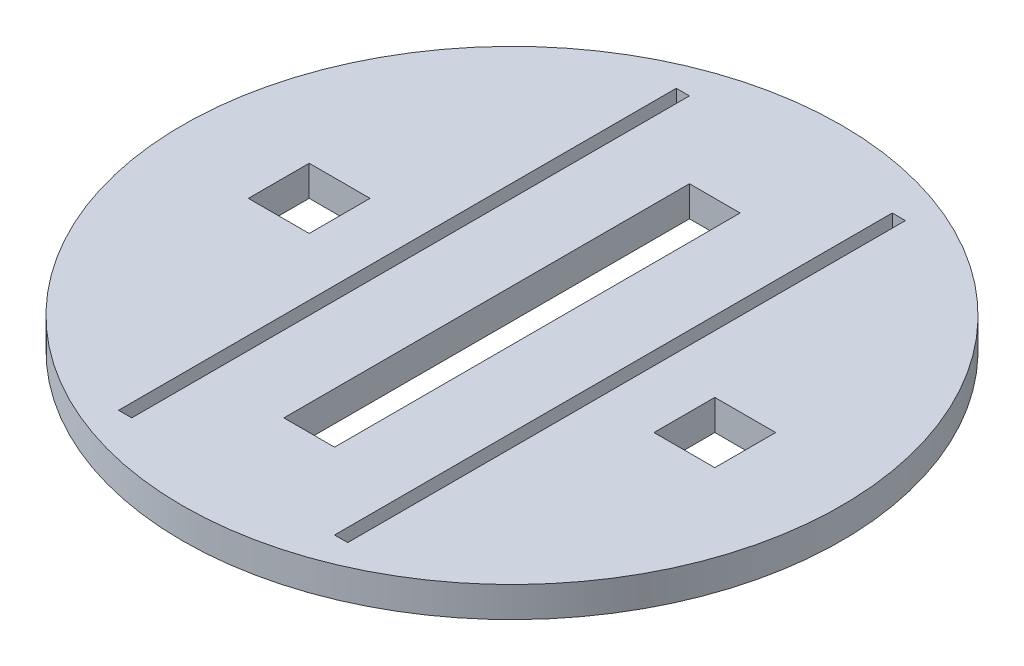
ISO-10303-21;
HEADER;
FILE_DESCRIPTION(('STEP AP214'),'2;1');
FILE_NAME('part.step','',(''),(''),'','','');
FILE_SCHEMA(('AUTOMOTIVE_DESIGN { 1 0 10303 214 1 1 1 1 }'));
ENDSEC;
DATA;
#1=APPLICATION_CONTEXT('core data for automotive mechanical design processes');
#2=APPLICATION_PROTOCOL_DEFINITION('international standard','automotive_design',2000,#1);
#3=PRODUCT_CONTEXT('',#1,'mechanical');
#4=PRODUCT('Part','Part','',(#3));
#5=PRODUCT_RELATED_PRODUCT_CATEGORY('part','',(#4));
#6=PRODUCT_DEFINITION_FORMATION('','',#4);
#7=PRODUCT_DEFINITION_CONTEXT('part definition',#1,'design');
#8=PRODUCT_DEFINITION('design','',#6,#7);
#9=PRODUCT_DEFINITION_SHAPE('','',#8);
#10=(LENGTH_UNIT() NAMED_UNIT(*) SI_UNIT(.MILLI.,.METRE.));
#11=(NAMED_UNIT(*) PLANE_ANGLE_UNIT() SI_UNIT($,.RADIAN.));
#12=(NAMED_UNIT(*) SI_UNIT($,.STERADIAN.) SOLID_ANGLE_UNIT());
#13=UNCERTAINTY_MEASURE_WITH_UNIT(LENGTH_MEASURE(1.E-05),#10,'distance_accuracy_value','');
#14=(GEOMETRIC_REPRESENTATION_CONTEXT(3) GLOBAL_UNCERTAINTY_ASSIGNED_CONTEXT((#13)) GLOBAL_UNIT_ASSIGNED_CONTEXT((#10,
#11,#12)) REPRESENTATION_CONTEXT('',''));
#15=CARTESIAN_POINT('',(0.,0.,0.));
#16=DIRECTION('',(0.,0.,1.));
#17=DIRECTION('',(1.,0.,0.));
#18=AXIS2_PLACEMENT_3D('',#15,#16,#17);
#19=CARTESIAN_POINT('',(0.,3.,0.));
#20=DIRECTION('',(0.,1.,0.));
#21=DIRECTION('',(0.,0.,1.));
#22=AXIS2_PLACEMENT_3D('',#19,#20,#21);
#23=PLANE('',#22);
#24=DIRECTION('',(0.,0.,1.));
#25=VECTOR('',#24,1.);
#26=CARTESIAN_POINT('',(-2.5,3.,0.));
#27=LINE('',#26,#25);
#28=CARTESIAN_POINT('',(-2.5,3.,-20.));
#29=VERTEX_POINT('',#28);
#30=CARTESIAN_POINT('',(-2.5,3.,20.));
#31=VERTEX_POINT('',#30);
#32=EDGE_CURVE('E218',#29,#31,#27,.T.);
#33=ORIENTED_EDGE('',*,*,#32,.F.);
#34=DIRECTION('',(-1.,0.,0.));
#35=VECTOR('',#34,1.);
#36=CARTESIAN_POINT('',(0.,3.,-20.));
#37=LINE('',#36,#35);
#38=CARTESIAN_POINT('',(2.5,3.,-20.));
#39=VERTEX_POINT('',#38);
#40=EDGE_CURVE('E211',#39,#29,#37,.T.);
#41=ORIENTED_EDGE('',*,*,#40,.F.);
#42=DIRECTION('',(0.,0.,-1.));
#43=VECTOR('',#42,1.);
#44=CARTESIAN_POINT('',(2.5,3.,0.));
#45=LINE('',#44,#43);
#46=CARTESIAN_POINT('',(2.5,3.,20.));
#47=VERTEX_POINT('',#46);
#48=EDGE_CURVE('E191',#47,#39,#45,.T.);
#49=ORIENTED_EDGE('',*,*,#48,.F.);
#50=DIRECTION('',(1.,0.,0.));
#51=VECTOR('',#50,1.);
#52=CARTESIAN_POINT('',(0.,3.,20.));
#53=LINE('',#52,#51);
#54=EDGE_CURVE('E216',#31,#47,#53,.T.);
#55=ORIENTED_EDGE('',*,*,#54,.F.);
#56=EDGE_LOOP('',(#33,#41,#49,#55));
#57=FACE_BOUND('',#56,.T.);
#58=DIRECTION('',(-1.,0.,0.));
#59=VECTOR('',#58,1.);
#60=CARTESIAN_POINT('',(0.,3.,-27.5));
#61=LINE('',#60,#59);
#62=CARTESIAN_POINT('',(-10.,3.,-27.5));
#63=VERTEX_POINT('',#62);
#64=CARTESIAN_POINT('',(-11.3,3.,-27.5));
#65=VERTEX_POINT('',#64);
#66=EDGE_CURVE('E323',#63,#65,#61,.T.);
#67=ORIENTED_EDGE('',*,*,#66,.F.);
#68=DIRECTION('',(0.,0.,-1.));
#69=VECTOR('',#68,1.);
#70=CARTESIAN_POINT('',(-10.,3.,0.));
#71=LINE('',#70,#69);
#72=CARTESIAN_POINT('',(-10.,3.,27.5));
#73=VERTEX_POINT('',#72);
#74=EDGE_CURVE('E325',#73,#63,#71,.T.);
#75=ORIENTED_EDGE('',*,*,#74,.F.);
#76=DIRECTION('',(-1.,0.,0.));
#77=VECTOR('',#76,1.);
#78=CARTESIAN_POINT('',(0.,3.,27.5));
#79=LINE('',#78,#77);
#80=CARTESIAN_POINT('',(-11.3,3.,27.5));
#81=VERTEX_POINT('',#80);
#82=EDGE_CURVE('E320',#73,#81,#79,.T.);
#83=ORIENTED_EDGE('',*,*,#82,.T.);
#84=DIRECTION('',(0.,0.,1.));
#85=VECTOR('',#84,1.);
#86=CARTESIAN_POINT('',(-11.3,3.,0.));
#87=LINE('',#86,#85);
#88=EDGE_CURVE('E327',#65,#81,#87,.T.);
#89=ORIENTED_EDGE('',*,*,#88,.F.);
#90=EDGE_LOOP('',(#67,#75,#83,#89));
#91=FACE_BOUND('',#90,.T.);
#92=CARTESIAN_POINT('',(0.,3.,0.));
#93=DIRECTION('',(0.,1.,0.));
#94=DIRECTION('',(0.,0.,1.));
#95=AXIS2_PLACEMENT_3D('',#92,#93,#94);
#96=CIRCLE('',#95,32.5);
#97=CARTESIAN_POINT('',(0.,3.,32.5));
#98=VERTEX_POINT('',#97);
#99=EDGE_CURVE('E331',#98,#98,#96,.T.);
#100=ORIENTED_EDGE('',*,*,#99,.T.);
#101=EDGE_LOOP('',(#100));
#102=FACE_BOUND('',#101,.T.);
#103=DIRECTION('',(0.,0.,1.));
#104=VECTOR('',#103,1.);
#105=CARTESIAN_POINT('',(10.,3.,0.));
#106=LINE('',#105,#104);
#107=CARTESIAN_POINT('',(10.,3.,-27.5));
#108=VERTEX_POINT('',#107);
#109=CARTESIAN_POINT('',(10.,3.,27.5));
#110=VERTEX_POINT('',#109);
#111=EDGE_CURVE('E317',#108,#110,#106,.T.);
#112=ORIENTED_EDGE('',*,*,#111,.F.);
#113=DIRECTION('',(1.,0.,0.));
#114=VECTOR('',#113,1.);
#115=CARTESIAN_POINT('',(0.,3.,-27.5));
#116=LINE('',#115,#114);
#117=CARTESIAN_POINT('',(11.3,3.,-27.5));
#118=VERTEX_POINT('',#117);
#119=EDGE_CURVE('E312',#108,#118,#116,.T.);
#120=ORIENTED_EDGE('',*,*,#119,.T.);
#121=DIRECTION('',(0.,0.,-1.));
#122=VECTOR('',#121,1.);
#123=CARTESIAN_POINT('',(11.3,3.,0.));
#124=LINE('',#123,#122);
#125=CARTESIAN_POINT('',(11.3,3.,27.5));
#126=VERTEX_POINT('',#125);
#127=EDGE_CURVE('E315',#126,#118,#124,.T.);
#128=ORIENTED_EDGE('',*,*,#127,.F.);
#129=DIRECTION('',(1.,0.,0.));
#130=VECTOR('',#129,1.);
#131=CARTESIAN_POINT('',(0.,3.,27.5));
#132=LINE('',#131,#130);
#133=EDGE_CURVE('E300',#110,#126,#132,.T.);
#134=ORIENTED_EDGE('',*,*,#133,.F.);
#135=EDGE_LOOP('',(#112,#120,#128,#134));
#136=FACE_BOUND('',#135,.T.);
#137=DIRECTION('',(1.,0.,0.));
#138=VECTOR('',#137,1.);
#139=CARTESIAN_POINT('',(0.,3.,-3.00000000000146));
#140=LINE('',#139,#138);
#141=CARTESIAN_POINT('',(17.0000000000001,3.,-3.00000000000147));
#142=VERTEX_POINT('',#141);
#143=CARTESIAN_POINT('',(23.0000000000001,3.,-3.00000000000147));
#144=VERTEX_POINT('',#143);
#145=EDGE_CURVE('E268',#142,#144,#140,.T.);
#146=ORIENTED_EDGE('',*,*,#145,.T.);
#147=DIRECTION('',(0.,0.,1.));
#148=VECTOR('',#147,1.);
#149=CARTESIAN_POINT('',(23.0000000000001,3.,0.));
#150=LINE('',#149,#148);
#151=CARTESIAN_POINT('',(23.0000000000001,3.,2.99999999999853));
#152=VERTEX_POINT('',#151);
#153=EDGE_CURVE('E271',#144,#152,#150,.T.);
#154=ORIENTED_EDGE('',*,*,#153,.T.);
#155=DIRECTION('',(-1.,0.,0.));
#156=VECTOR('',#155,1.);
#157=CARTESIAN_POINT('',(0.,3.,2.99999999999854));
#158=LINE('',#157,#156);
#159=CARTESIAN_POINT('',(17.0000000000001,3.,2.99999999999853));
#160=VERTEX_POINT('',#159);
#161=EDGE_CURVE('E243',#152,#160,#158,.T.);
#162=ORIENTED_EDGE('',*,*,#161,.T.);
#163=DIRECTION('',(0.,0.,-1.));
#164=VECTOR('',#163,1.);
#165=CARTESIAN_POINT('',(17.0000000000001,3.,0.));
#166=LINE('',#165,#164);
#167=EDGE_CURVE('E265',#160,#142,#166,.T.);
#168=ORIENTED_EDGE('',*,*,#167,.T.);
#169=EDGE_LOOP('',(#146,#154,#162,#168));
#170=FACE_BOUND('',#169,.T.);
#171=DIRECTION('',(-1.,0.,0.));
#172=VECTOR('',#171,1.);
#173=CARTESIAN_POINT('',(0.,3.,3.));
#174=LINE('',#173,#172);
#175=CARTESIAN_POINT('',(-17.,3.,3.));
#176=VERTEX_POINT('',#175);
#177=CARTESIAN_POINT('',(-23.,3.,3.));
#178=VERTEX_POINT('',#177);
#179=EDGE_CURVE('E280',#176,#178,#174,.T.);
#180=ORIENTED_EDGE('',*,*,#179,.T.);
#181=DIRECTION('',(0.,0.,-1.));
#182=VECTOR('',#181,1.);
#183=CARTESIAN_POINT('',(-23.,3.,0.));
#184=LINE('',#183,#182);
#185=CARTESIAN_POINT('',(-23.,3.,-3.));
#186=VERTEX_POINT('',#185);
#187=EDGE_CURVE('E283',#178,#186,#184,.T.);
#188=ORIENTED_EDGE('',*,*,#187,.T.);
#189=DIRECTION('',(1.,0.,0.));
#190=VECTOR('',#189,1.);
#191=CARTESIAN_POINT('',(0.,3.,-3.));
#192=LINE('',#191,#190);
#193=CARTESIAN_POINT('',(-17.,3.,-3.));
#194=VERTEX_POINT('',#193);
#195=EDGE_CURVE('E274',#186,#194,#192,.T.);
#196=ORIENTED_EDGE('',*,*,#195,.T.);
#197=DIRECTION('',(0.,0.,1.));
#198=VECTOR('',#197,1.);
#199=CARTESIAN_POINT('',(-17.,3.,0.));
#200=LINE('',#199,#198);
#201=EDGE_CURVE('E277',#194,#176,#200,.T.);
#202=ORIENTED_EDGE('',*,*,#201,.T.);
#203=EDGE_LOOP('',(#180,#188,#196,#202));
#204=FACE_BOUND('',#203,.T.);
#205=ADVANCED_FACE('F48',(#57,#91,#102,#136,#170,#204),#23,.T.);
#206=CARTESIAN_POINT('',(0.,0.,0.));
#207=DIRECTION('',(0.,1.,0.));
#208=DIRECTION('',(0.,0.,1.));
#209=AXIS2_PLACEMENT_3D('',#206,#207,#208);
#210=PLANE('',#209);
#211=DIRECTION('',(1.,0.,0.));
#212=VECTOR('',#211,1.);
#213=CARTESIAN_POINT('',(2.5,0.,-20.));
#214=LINE('',#213,#212);
#215=CARTESIAN_POINT('',(-2.5,0.,-20.));
#216=VERTEX_POINT('',#215);
#217=CARTESIAN_POINT('',(2.5,0.,-20.));
#218=VERTEX_POINT('',#217);
#219=EDGE_CURVE('E197',#216,#218,#214,.T.);
#220=ORIENTED_EDGE('',*,*,#219,.F.);
#221=DIRECTION('',(0.,0.,-1.));
#222=VECTOR('',#221,1.);
#223=CARTESIAN_POINT('',(-2.5,0.,-20.));
#224=LINE('',#223,#222);
#225=CARTESIAN_POINT('',(-2.5,0.,20.));
#226=VERTEX_POINT('',#225);
#227=EDGE_CURVE('E71',#226,#216,#224,.T.);
#228=ORIENTED_EDGE('',*,*,#227,.F.);
#229=DIRECTION('',(-1.,0.,0.));
#230=VECTOR('',#229,1.);
#231=CARTESIAN_POINT('',(2.5,0.,20.));
#232=LINE('',#231,#230);
#233=CARTESIAN_POINT('',(2.5,0.,20.));
#234=VERTEX_POINT('',#233);
#235=EDGE_CURVE('E204',#234,#226,#232,.T.);
#236=ORIENTED_EDGE('',*,*,#235,.F.);
#237=DIRECTION('',(0.,0.,1.));
#238=VECTOR('',#237,1.);
#239=CARTESIAN_POINT('',(2.5,0.,-20.));
#240=LINE('',#239,#238);
#241=EDGE_CURVE('E188',#218,#234,#240,.T.);
#242=ORIENTED_EDGE('',*,*,#241,.F.);
#243=EDGE_LOOP('',(#220,#228,#236,#242));
#244=FACE_BOUND('',#243,.T.);
#245=DIRECTION('',(0.,0.,-1.));
#246=VECTOR('',#245,1.);
#247=CARTESIAN_POINT('',(23.0000000000001,0.,2.99999999999853));
#248=LINE('',#247,#246);
#249=CARTESIAN_POINT('',(23.0000000000001,0.,2.99999999999853));
#250=VERTEX_POINT('',#249);
#251=CARTESIAN_POINT('',(23.0000000000001,0.,-3.00000000000147));
#252=VERTEX_POINT('',#251);
#253=EDGE_CURVE('E220',#250,#252,#248,.T.);
#254=ORIENTED_EDGE('',*,*,#253,.T.);
#255=DIRECTION('',(-1.,0.,0.));
#256=VECTOR('',#255,1.);
#257=CARTESIAN_POINT('',(17.0000000000001,0.,-3.00000000000147));
#258=LINE('',#257,#256);
#259=CARTESIAN_POINT('',(17.0000000000001,0.,-3.00000000000147));
#260=VERTEX_POINT('',#259);
#261=EDGE_CURVE('E246',#252,#260,#258,.T.);
#262=ORIENTED_EDGE('',*,*,#261,.T.);
#263=DIRECTION('',(0.,0.,1.));
#264=VECTOR('',#263,1.);
#265=CARTESIAN_POINT('',(17.0000000000001,0.,2.99999999999853));
#266=LINE('',#265,#264);
#267=CARTESIAN_POINT('',(17.0000000000001,0.,2.99999999999853));
#268=VERTEX_POINT('',#267);
#269=EDGE_CURVE('E249',#260,#268,#266,.T.);
#270=ORIENTED_EDGE('',*,*,#269,.T.);
#271=DIRECTION('',(1.,0.,0.));
#272=VECTOR('',#271,1.);
#273=CARTESIAN_POINT('',(17.0000000000001,0.,2.99999999999853));
#274=LINE('',#273,#272);
#275=EDGE_CURVE('E252',#268,#250,#274,.T.);
#276=ORIENTED_EDGE('',*,*,#275,.T.);
#277=EDGE_LOOP('',(#254,#262,#270,#276));
#278=FACE_BOUND('',#277,.T.);
#279=DIRECTION('',(0.,0.,-1.));
#280=VECTOR('',#279,1.);
#281=CARTESIAN_POINT('',(-10.,0.,0.));
#282=LINE('',#281,#280);
#283=CARTESIAN_POINT('',(-10.,0.,27.5));
#284=VERTEX_POINT('',#283);
#285=CARTESIAN_POINT('',(-10.,0.,-27.5));
#286=VERTEX_POINT('',#285);
#287=EDGE_CURVE('E349',#284,#286,#282,.T.);
#288=ORIENTED_EDGE('',*,*,#287,.T.);
#289=DIRECTION('',(-1.,0.,0.));
#290=VECTOR('',#289,1.);
#291=CARTESIAN_POINT('',(0.,0.,-27.5));
#292=LINE('',#291,#290);
#293=CARTESIAN_POINT('',(-11.3,0.,-27.5));
#294=VERTEX_POINT('',#293);
#295=EDGE_CURVE('E13',#286,#294,#292,.T.);
#296=ORIENTED_EDGE('',*,*,#295,.T.);
#297=DIRECTION('',(0.,0.,1.));
#298=VECTOR('',#297,1.);
#299=CARTESIAN_POINT('',(-11.3,0.,0.));
#300=LINE('',#299,#298);
#301=CARTESIAN_POINT('',(-11.3,0.,27.5));
#302=VERTEX_POINT('',#301);
#303=EDGE_CURVE('E56',#294,#302,#300,.T.);
#304=ORIENTED_EDGE('',*,*,#303,.T.);
#305=DIRECTION('',(-1.,0.,0.));
#306=VECTOR('',#305,1.);
#307=CARTESIAN_POINT('',(0.,0.,27.5));
#308=LINE('',#307,#306);
#309=EDGE_CURVE('E347',#284,#302,#308,.T.);
#310=ORIENTED_EDGE('',*,*,#309,.F.);
#311=EDGE_LOOP('',(#288,#296,#304,#310));
#312=FACE_BOUND('',#311,.T.);
#313=CARTESIAN_POINT('',(0.,0.,0.));
#314=DIRECTION('',(0.,1.,0.));
#315=DIRECTION('',(0.,0.,1.));
#316=AXIS2_PLACEMENT_3D('',#313,#314,#315);
#317=CIRCLE('',#316,32.5);
#318=CARTESIAN_POINT('',(0.,0.,32.5));
#319=VERTEX_POINT('',#318);
#320=EDGE_CURVE('E330',#319,#319,#317,.T.);
#321=ORIENTED_EDGE('',*,*,#320,.F.);
#322=EDGE_LOOP('',(#321));
#323=FACE_BOUND('',#322,.T.);
#324=DIRECTION('',(1.,0.,0.));
#325=VECTOR('',#324,1.);
#326=CARTESIAN_POINT('',(0.,0.,-27.5));
#327=LINE('',#326,#325);
#328=CARTESIAN_POINT('',(10.,0.,-27.5));
#329=VERTEX_POINT('',#328);
#330=CARTESIAN_POINT('',(11.3,0.,-27.5));
#331=VERTEX_POINT('',#330);
#332=EDGE_CURVE('E345',#329,#331,#327,.T.);
#333=ORIENTED_EDGE('',*,*,#332,.F.);
#334=DIRECTION('',(0.,0.,1.));
#335=VECTOR('',#334,1.);
#336=CARTESIAN_POINT('',(10.,0.,0.));
#337=LINE('',#336,#335);
#338=CARTESIAN_POINT('',(10.,0.,27.5));
#339=VERTEX_POINT('',#338);
#340=EDGE_CURVE('E342',#329,#339,#337,.T.);
#341=ORIENTED_EDGE('',*,*,#340,.T.);
#342=DIRECTION('',(1.,0.,0.));
#343=VECTOR('',#342,1.);
#344=CARTESIAN_POINT('',(0.,0.,27.5));
#345=LINE('',#344,#343);
#346=CARTESIAN_POINT('',(11.3,0.,27.5));
#347=VERTEX_POINT('',#346);
#348=EDGE_CURVE('E334',#339,#347,#345,.T.);
#349=ORIENTED_EDGE('',*,*,#348,.T.);
#350=DIRECTION('',(0.,0.,-1.));
#351=VECTOR('',#350,1.);
#352=CARTESIAN_POINT('',(11.3,0.,0.));
#353=LINE('',#352,#351);
#354=EDGE_CURVE('E339',#347,#331,#353,.T.);
#355=ORIENTED_EDGE('',*,*,#354,.T.);
#356=EDGE_LOOP('',(#333,#341,#349,#355));
#357=FACE_BOUND('',#356,.T.);
#358=DIRECTION('',(0.,0.,1.));
#359=VECTOR('',#358,1.);
#360=CARTESIAN_POINT('',(-23.,0.,-3.));
#361=LINE('',#360,#359);
#362=CARTESIAN_POINT('',(-23.,0.,-3.));
#363=VERTEX_POINT('',#362);
#364=CARTESIAN_POINT('',(-23.,0.,3.));
#365=VERTEX_POINT('',#364);
#366=EDGE_CURVE('E221',#363,#365,#361,.T.);
#367=ORIENTED_EDGE('',*,*,#366,.T.);
#368=DIRECTION('',(1.,0.,0.));
#369=VECTOR('',#368,1.);
#370=CARTESIAN_POINT('',(-17.,0.,3.));
#371=LINE('',#370,#369);
#372=CARTESIAN_POINT('',(-17.,0.,3.));
#373=VERTEX_POINT('',#372);
#374=EDGE_CURVE('E224',#365,#373,#371,.T.);
#375=ORIENTED_EDGE('',*,*,#374,.T.);
#376=DIRECTION('',(0.,0.,-1.));
#377=VECTOR('',#376,1.);
#378=CARTESIAN_POINT('',(-17.,0.,-3.));
#379=LINE('',#378,#377);
#380=CARTESIAN_POINT('',(-17.,0.,-3.));
#381=VERTEX_POINT('',#380);
#382=EDGE_CURVE('E228',#373,#381,#379,.T.);
#383=ORIENTED_EDGE('',*,*,#382,.T.);
#384=DIRECTION('',(-1.,0.,0.));
#385=VECTOR('',#384,1.);
#386=CARTESIAN_POINT('',(-17.,0.,-3.));
#387=LINE('',#386,#385);
#388=EDGE_CURVE('E231',#381,#363,#387,.T.);
#389=ORIENTED_EDGE('',*,*,#388,.T.);
#390=EDGE_LOOP('',(#367,#375,#383,#389));
#391=FACE_BOUND('',#390,.T.);
#392=ADVANCED_FACE('F201',(#244,#278,#312,#323,#357,#391),#210,.F.);
#393=CARTESIAN_POINT('',(0.,3.,0.));
#394=DIRECTION('',(0.,-1.,0.));
#395=DIRECTION('',(0.,0.,-1.));
#396=AXIS2_PLACEMENT_3D('',#393,#394,#395);
#397=CYLINDRICAL_SURFACE('',#396,32.5);
#398=ORIENTED_EDGE('',*,*,#99,.F.);
#399=EDGE_LOOP('',(#398));
#400=FACE_BOUND('',#399,.T.);
#401=ORIENTED_EDGE('',*,*,#320,.T.);
#402=EDGE_LOOP('',(#401));
#403=FACE_BOUND('',#402,.T.);
#404=ADVANCED_FACE('F50',(#400,#403),#397,.T.);
#405=CARTESIAN_POINT('',(10.,3.36431925174415,-27.5));
#406=DIRECTION('',(-1.,0.,0.));
#407=DIRECTION('',(0.,0.,1.));
#408=AXIS2_PLACEMENT_3D('',#405,#406,#407);
#409=PLANE('',#408);
#410=ORIENTED_EDGE('',*,*,#111,.T.);
#411=DIRECTION('',(0.,-1.,0.));
#412=VECTOR('',#411,1.);
#413=CARTESIAN_POINT('',(10.,3.36431925174415,27.5));
#414=LINE('',#413,#412);
#415=EDGE_CURVE('E286',#110,#339,#414,.T.);
#416=ORIENTED_EDGE('',*,*,#415,.T.);
#417=ORIENTED_EDGE('',*,*,#340,.F.);
#418=DIRECTION('',(0.,-1.,0.));
#419=VECTOR('',#418,1.);
#420=CARTESIAN_POINT('',(10.,3.36431925174415,-27.5));
#421=LINE('',#420,#419);
#422=EDGE_CURVE('E306',#108,#329,#421,.T.);
#423=ORIENTED_EDGE('',*,*,#422,.F.);
#424=EDGE_LOOP('',(#410,#416,#417,#423));
#425=FACE_BOUND('',#424,.T.);
#426=ADVANCED_FACE('F388',(#425),#409,.F.);
#427=CARTESIAN_POINT('',(11.3,3.36431925174415,-27.5));
#428=DIRECTION('',(1.,0.,0.));
#429=DIRECTION('',(0.,1.,0.));
#430=AXIS2_PLACEMENT_3D('',#427,#428,#429);
#431=PLANE('',#430);
#432=ORIENTED_EDGE('',*,*,#127,.T.);
#433=DIRECTION('',(0.,1.,0.));
#434=VECTOR('',#433,1.);
#435=CARTESIAN_POINT('',(11.3,3.36431925174415,-27.5));
#436=LINE('',#435,#434);
#437=EDGE_CURVE('E291',#331,#118,#436,.T.);
#438=ORIENTED_EDGE('',*,*,#437,.F.);
#439=ORIENTED_EDGE('',*,*,#354,.F.);
#440=DIRECTION('',(0.,1.,0.));
#441=VECTOR('',#440,1.);
#442=CARTESIAN_POINT('',(11.3,3.36431925174415,27.5));
#443=LINE('',#442,#441);
#444=EDGE_CURVE('E303',#347,#126,#443,.T.);
#445=ORIENTED_EDGE('',*,*,#444,.T.);
#446=EDGE_LOOP('',(#432,#438,#439,#445));
#447=FACE_BOUND('',#446,.T.);
#448=ADVANCED_FACE('F391',(#447),#431,.F.);
#449=CARTESIAN_POINT('',(0.,0.,-27.5));
#450=DIRECTION('',(0.,0.,1.));
#451=DIRECTION('',(1.,0.,0.));
#452=AXIS2_PLACEMENT_3D('',#449,#450,#451);
#453=PLANE('',#452);
#454=ORIENTED_EDGE('',*,*,#422,.T.);
#455=ORIENTED_EDGE('',*,*,#332,.T.);
#456=ORIENTED_EDGE('',*,*,#437,.T.);
#457=ORIENTED_EDGE('',*,*,#119,.F.);
#458=EDGE_LOOP('',(#454,#455,#456,#457));
#459=FACE_BOUND('',#458,.T.);
#460=ADVANCED_FACE('F395',(#459),#453,.T.);
#461=CARTESIAN_POINT('',(0.,0.,27.5));
#462=DIRECTION('',(0.,0.,1.));
#463=DIRECTION('',(1.,0.,0.));
#464=AXIS2_PLACEMENT_3D('',#461,#462,#463);
#465=PLANE('',#464);
#466=ORIENTED_EDGE('',*,*,#133,.T.);
#467=ORIENTED_EDGE('',*,*,#444,.F.);
#468=ORIENTED_EDGE('',*,*,#348,.F.);
#469=ORIENTED_EDGE('',*,*,#415,.F.);
#470=EDGE_LOOP('',(#466,#467,#468,#469));
#471=FACE_BOUND('',#470,.T.);
#472=ADVANCED_FACE('F378',(#471),#465,.F.);
#473=CARTESIAN_POINT('',(-11.3,3.36431925174415,-27.5));
#474=DIRECTION('',(-1.,0.,0.));
#475=DIRECTION('',(0.,-1.,0.));
#476=AXIS2_PLACEMENT_3D('',#473,#474,#475);
#477=PLANE('',#476);
#478=ORIENTED_EDGE('',*,*,#88,.T.);
#479=DIRECTION('',(0.,-1.,0.));
#480=VECTOR('',#479,1.);
#481=CARTESIAN_POINT('',(-11.3,3.36431925174415,27.5));
#482=LINE('',#481,#480);
#483=EDGE_CURVE('E287',#81,#302,#482,.T.);
#484=ORIENTED_EDGE('',*,*,#483,.T.);
#485=ORIENTED_EDGE('',*,*,#303,.F.);
#486=DIRECTION('',(0.,-1.,0.));
#487=VECTOR('',#486,1.);
#488=CARTESIAN_POINT('',(-11.3,3.36431925174415,-27.5));
#489=LINE('',#488,#487);
#490=EDGE_CURVE('E294',#65,#294,#489,.T.);
#491=ORIENTED_EDGE('',*,*,#490,.F.);
#492=EDGE_LOOP('',(#478,#484,#485,#491));
#493=FACE_BOUND('',#492,.T.);
#494=ADVANCED_FACE('F357',(#493),#477,.F.);
#495=CARTESIAN_POINT('',(-10.,3.36431925174415,-27.5));
#496=DIRECTION('',(1.,0.,0.));
#497=DIRECTION('',(0.,0.,-1.));
#498=AXIS2_PLACEMENT_3D('',#495,#496,#497);
#499=PLANE('',#498);
#500=ORIENTED_EDGE('',*,*,#74,.T.);
#501=DIRECTION('',(0.,1.,0.));
#502=VECTOR('',#501,1.);
#503=CARTESIAN_POINT('',(-10.,3.36431925174415,-27.5));
#504=LINE('',#503,#502);
#505=EDGE_CURVE('E297',#286,#63,#504,.T.);
#506=ORIENTED_EDGE('',*,*,#505,.F.);
#507=ORIENTED_EDGE('',*,*,#287,.F.);
#508=DIRECTION('',(0.,1.,0.));
#509=VECTOR('',#508,1.);
#510=CARTESIAN_POINT('',(-10.,3.36431925174415,27.5));
#511=LINE('',#510,#509);
#512=EDGE_CURVE('E290',#284,#73,#511,.T.);
#513=ORIENTED_EDGE('',*,*,#512,.T.);
#514=EDGE_LOOP('',(#500,#506,#507,#513));
#515=FACE_BOUND('',#514,.T.);
#516=ADVANCED_FACE('F370',(#515),#499,.F.);
#517=CARTESIAN_POINT('',(0.,0.,-27.5));
#518=DIRECTION('',(0.,0.,-1.));
#519=DIRECTION('',(-1.,0.,0.));
#520=AXIS2_PLACEMENT_3D('',#517,#518,#519);
#521=PLANE('',#520);
#522=ORIENTED_EDGE('',*,*,#66,.T.);
#523=ORIENTED_EDGE('',*,*,#490,.T.);
#524=ORIENTED_EDGE('',*,*,#295,.F.);
#525=ORIENTED_EDGE('',*,*,#505,.T.);
#526=EDGE_LOOP('',(#522,#523,#524,#525));
#527=FACE_BOUND('',#526,.T.);
#528=ADVANCED_FACE('F360',(#527),#521,.F.);
#529=CARTESIAN_POINT('',(0.,0.,27.5));
#530=DIRECTION('',(0.,0.,-1.));
#531=DIRECTION('',(-1.,0.,0.));
#532=AXIS2_PLACEMENT_3D('',#529,#530,#531);
#533=PLANE('',#532);
#534=ORIENTED_EDGE('',*,*,#512,.F.);
#535=ORIENTED_EDGE('',*,*,#309,.T.);
#536=ORIENTED_EDGE('',*,*,#483,.F.);
#537=ORIENTED_EDGE('',*,*,#82,.F.);
#538=EDGE_LOOP('',(#534,#535,#536,#537));
#539=FACE_BOUND('',#538,.T.);
#540=ADVANCED_FACE('F367',(#539),#533,.T.);
#541=CARTESIAN_POINT('',(23.0000000000001,10.,2.99999999999853));
#542=DIRECTION('',(-1.,0.,0.));
#543=DIRECTION('',(0.,0.,1.));
#544=AXIS2_PLACEMENT_3D('',#541,#542,#543);
#545=PLANE('',#544);
#546=DIRECTION('',(0.,-1.,0.));
#547=VECTOR('',#546,1.);
#548=CARTESIAN_POINT('',(23.0000000000001,10.,-3.00000000000147));
#549=LINE('',#548,#547);
#550=EDGE_CURVE('E225',#144,#252,#549,.T.);
#551=ORIENTED_EDGE('',*,*,#550,.T.);
#552=ORIENTED_EDGE('',*,*,#253,.F.);
#553=DIRECTION('',(0.,-1.,0.));
#554=VECTOR('',#553,1.);
#555=CARTESIAN_POINT('',(23.0000000000001,10.,2.99999999999853));
#556=LINE('',#555,#554);
#557=EDGE_CURVE('E255',#152,#250,#556,.T.);
#558=ORIENTED_EDGE('',*,*,#557,.F.);
#559=ORIENTED_EDGE('',*,*,#153,.F.);
#560=EDGE_LOOP('',(#551,#552,#558,#559));
#561=FACE_BOUND('',#560,.T.);
#562=ADVANCED_FACE('F455',(#561),#545,.T.);
#563=CARTESIAN_POINT('',(17.0000000000001,10.,-3.00000000000147));
#564=DIRECTION('',(0.,0.,1.));
#565=DIRECTION('',(1.,0.,0.));
#566=AXIS2_PLACEMENT_3D('',#563,#564,#565);
#567=PLANE('',#566);
#568=DIRECTION('',(0.,-1.,0.));
#569=VECTOR('',#568,1.);
#570=CARTESIAN_POINT('',(17.0000000000001,10.,-3.00000000000147));
#571=LINE('',#570,#569);
#572=EDGE_CURVE('E260',#142,#260,#571,.T.);
#573=ORIENTED_EDGE('',*,*,#572,.T.);
#574=ORIENTED_EDGE('',*,*,#261,.F.);
#575=ORIENTED_EDGE('',*,*,#550,.F.);
#576=ORIENTED_EDGE('',*,*,#145,.F.);
#577=EDGE_LOOP('',(#573,#574,#575,#576));
#578=FACE_BOUND('',#577,.T.);
#579=ADVANCED_FACE('F451',(#578),#567,.T.);
#580=CARTESIAN_POINT('',(17.0000000000001,10.,2.99999999999853));
#581=DIRECTION('',(1.,0.,0.));
#582=DIRECTION('',(0.,0.,-1.));
#583=AXIS2_PLACEMENT_3D('',#580,#581,#582);
#584=PLANE('',#583);
#585=DIRECTION('',(0.,-1.,0.));
#586=VECTOR('',#585,1.);
#587=CARTESIAN_POINT('',(17.0000000000001,10.,2.99999999999853));
#588=LINE('',#587,#586);
#589=EDGE_CURVE('E258',#160,#268,#588,.T.);
#590=ORIENTED_EDGE('',*,*,#589,.T.);
#591=ORIENTED_EDGE('',*,*,#269,.F.);
#592=ORIENTED_EDGE('',*,*,#572,.F.);
#593=ORIENTED_EDGE('',*,*,#167,.F.);
#594=EDGE_LOOP('',(#590,#591,#592,#593));
#595=FACE_BOUND('',#594,.T.);
#596=ADVANCED_FACE('F447',(#595),#584,.T.);
#597=CARTESIAN_POINT('',(17.0000000000001,10.,2.99999999999853));
#598=DIRECTION('',(0.,0.,-1.));
#599=DIRECTION('',(-1.,0.,0.));
#600=AXIS2_PLACEMENT_3D('',#597,#598,#599);
#601=PLANE('',#600);
#602=ORIENTED_EDGE('',*,*,#557,.T.);
#603=ORIENTED_EDGE('',*,*,#275,.F.);
#604=ORIENTED_EDGE('',*,*,#589,.F.);
#605=ORIENTED_EDGE('',*,*,#161,.F.);
#606=EDGE_LOOP('',(#602,#603,#604,#605));
#607=FACE_BOUND('',#606,.T.);
#608=ADVANCED_FACE('F444',(#607),#601,.T.);
#609=CARTESIAN_POINT('',(-23.,10.,-3.));
#610=DIRECTION('',(1.,0.,0.));
#611=DIRECTION('',(0.,0.,-1.));
#612=AXIS2_PLACEMENT_3D('',#609,#610,#611);
#613=PLANE('',#612);
#614=DIRECTION('',(0.,-1.,0.));
#615=VECTOR('',#614,1.);
#616=CARTESIAN_POINT('',(-23.,10.,3.));
#617=LINE('',#616,#615);
#618=EDGE_CURVE('E241',#178,#365,#617,.T.);
#619=ORIENTED_EDGE('',*,*,#618,.T.);
#620=ORIENTED_EDGE('',*,*,#366,.F.);
#621=DIRECTION('',(0.,-1.,0.));
#622=VECTOR('',#621,1.);
#623=CARTESIAN_POINT('',(-23.,10.,-3.));
#624=LINE('',#623,#622);
#625=EDGE_CURVE('E234',#186,#363,#624,.T.);
#626=ORIENTED_EDGE('',*,*,#625,.F.);
#627=ORIENTED_EDGE('',*,*,#187,.F.);
#628=EDGE_LOOP('',(#619,#620,#626,#627));
#629=FACE_BOUND('',#628,.T.);
#630=ADVANCED_FACE('F419',(#629),#613,.T.);
#631=CARTESIAN_POINT('',(-17.,10.,3.));
#632=DIRECTION('',(0.,0.,-1.));
#633=DIRECTION('',(-1.,0.,0.));
#634=AXIS2_PLACEMENT_3D('',#631,#632,#633);
#635=PLANE('',#634);
#636=DIRECTION('',(0.,-1.,0.));
#637=VECTOR('',#636,1.);
#638=CARTESIAN_POINT('',(-17.,10.,3.));
#639=LINE('',#638,#637);
#640=EDGE_CURVE('E239',#176,#373,#639,.T.);
#641=ORIENTED_EDGE('',*,*,#640,.T.);
#642=ORIENTED_EDGE('',*,*,#374,.F.);
#643=ORIENTED_EDGE('',*,*,#618,.F.);
#644=ORIENTED_EDGE('',*,*,#179,.F.);
#645=EDGE_LOOP('',(#641,#642,#643,#644));
#646=FACE_BOUND('',#645,.T.);
#647=ADVANCED_FACE('F426',(#646),#635,.T.);
#648=CARTESIAN_POINT('',(-17.,10.,-3.));
#649=DIRECTION('',(-1.,0.,0.));
#650=DIRECTION('',(0.,0.,1.));
#651=AXIS2_PLACEMENT_3D('',#648,#649,#650);
#652=PLANE('',#651);
#653=DIRECTION('',(0.,-1.,0.));
#654=VECTOR('',#653,1.);
#655=CARTESIAN_POINT('',(-17.,10.,-3.));
#656=LINE('',#655,#654);
#657=EDGE_CURVE('E237',#194,#381,#656,.T.);
#658=ORIENTED_EDGE('',*,*,#657,.T.);
#659=ORIENTED_EDGE('',*,*,#382,.F.);
#660=ORIENTED_EDGE('',*,*,#640,.F.);
#661=ORIENTED_EDGE('',*,*,#201,.F.);
#662=EDGE_LOOP('',(#658,#659,#660,#661));
#663=FACE_BOUND('',#662,.T.);
#664=ADVANCED_FACE('F430',(#663),#652,.T.);
#665=CARTESIAN_POINT('',(-17.,10.,-3.));
#666=DIRECTION('',(0.,0.,1.));
#667=DIRECTION('',(1.,0.,0.));
#668=AXIS2_PLACEMENT_3D('',#665,#666,#667);
#669=PLANE('',#668);
#670=ORIENTED_EDGE('',*,*,#625,.T.);
#671=ORIENTED_EDGE('',*,*,#388,.F.);
#672=ORIENTED_EDGE('',*,*,#657,.F.);
#673=ORIENTED_EDGE('',*,*,#195,.F.);
#674=EDGE_LOOP('',(#670,#671,#672,#673));
#675=FACE_BOUND('',#674,.T.);
#676=ADVANCED_FACE('F422',(#675),#669,.T.);
#677=CARTESIAN_POINT('',(-2.5,10.,-20.));
#678=DIRECTION('',(-1.,0.,0.));
#679=DIRECTION('',(0.,0.,1.));
#680=AXIS2_PLACEMENT_3D('',#677,#678,#679);
#681=PLANE('',#680);
#682=ORIENTED_EDGE('',*,*,#32,.T.);
#683=DIRECTION('',(0.,-1.,0.));
#684=VECTOR('',#683,1.);
#685=CARTESIAN_POINT('',(-2.5,10.,20.));
#686=LINE('',#685,#684);
#687=EDGE_CURVE('E209',#31,#226,#686,.T.);
#688=ORIENTED_EDGE('',*,*,#687,.T.);
#689=ORIENTED_EDGE('',*,*,#227,.T.);
#690=DIRECTION('',(0.,-1.,0.));
#691=VECTOR('',#690,1.);
#692=CARTESIAN_POINT('',(-2.5,10.,-20.));
#693=LINE('',#692,#691);
#694=EDGE_CURVE('E194',#29,#216,#693,.T.);
#695=ORIENTED_EDGE('',*,*,#694,.F.);
#696=EDGE_LOOP('',(#682,#688,#689,#695));
#697=FACE_BOUND('',#696,.T.);
#698=ADVANCED_FACE('F437',(#697),#681,.F.);
#699=CARTESIAN_POINT('',(2.5,10.,20.));
#700=DIRECTION('',(0.,0.,1.));
#701=DIRECTION('',(1.,0.,0.));
#702=AXIS2_PLACEMENT_3D('',#699,#700,#701);
#703=PLANE('',#702);
#704=ORIENTED_EDGE('',*,*,#54,.T.);
#705=DIRECTION('',(0.,-1.,0.));
#706=VECTOR('',#705,1.);
#707=CARTESIAN_POINT('',(2.5,10.,20.));
#708=LINE('',#707,#706);
#709=EDGE_CURVE('E193',#47,#234,#708,.T.);
#710=ORIENTED_EDGE('',*,*,#709,.T.);
#711=ORIENTED_EDGE('',*,*,#235,.T.);
#712=ORIENTED_EDGE('',*,*,#687,.F.);
#713=EDGE_LOOP('',(#704,#710,#711,#712));
#714=FACE_BOUND('',#713,.T.);
#715=ADVANCED_FACE('F519',(#714),#703,.F.);
#716=CARTESIAN_POINT('',(2.5,10.,-20.));
#717=DIRECTION('',(1.,0.,0.));
#718=DIRECTION('',(0.,0.,-1.));
#719=AXIS2_PLACEMENT_3D('',#716,#717,#718);
#720=PLANE('',#719);
#721=ORIENTED_EDGE('',*,*,#48,.T.);
#722=DIRECTION('',(0.,-1.,0.));
#723=VECTOR('',#722,1.);
#724=CARTESIAN_POINT('',(2.5,10.,-20.));
#725=LINE('',#724,#723);
#726=EDGE_CURVE('E63',#39,#218,#725,.T.);
#727=ORIENTED_EDGE('',*,*,#726,.T.);
#728=ORIENTED_EDGE('',*,*,#241,.T.);
#729=ORIENTED_EDGE('',*,*,#709,.F.);
#730=EDGE_LOOP('',(#721,#727,#728,#729));
#731=FACE_BOUND('',#730,.T.);
#732=ADVANCED_FACE('F185',(#731),#720,.F.);
#733=CARTESIAN_POINT('',(2.5,10.,-20.));
#734=DIRECTION('',(0.,0.,-1.));
#735=DIRECTION('',(-1.,0.,0.));
#736=AXIS2_PLACEMENT_3D('',#733,#734,#735);
#737=PLANE('',#736);
#738=ORIENTED_EDGE('',*,*,#40,.T.);
#739=ORIENTED_EDGE('',*,*,#694,.T.);
#740=ORIENTED_EDGE('',*,*,#219,.T.);
#741=ORIENTED_EDGE('',*,*,#726,.F.);
#742=EDGE_LOOP('',(#738,#739,#740,#741));
#743=FACE_BOUND('',#742,.T.);
#744=ADVANCED_FACE('F198',(#743),#737,.F.);
#745=CLOSED_SHELL('',(#205,#392,#404,#426,#448,#460,#472,#494,#516,#528,#540,#562,#579,#596,
#608,#630,#647,#664,#676,#698,#715,#732,#744));
#746=MANIFOLD_SOLID_BREP('B2',#745);
#747=ADVANCED_BREP_SHAPE_REPRESENTATION('',(#18,#746),#14);
#748=SHAPE_DEFINITION_REPRESENTATION(#9,#747);
ENDSEC;
END-ISO-10303-21;
